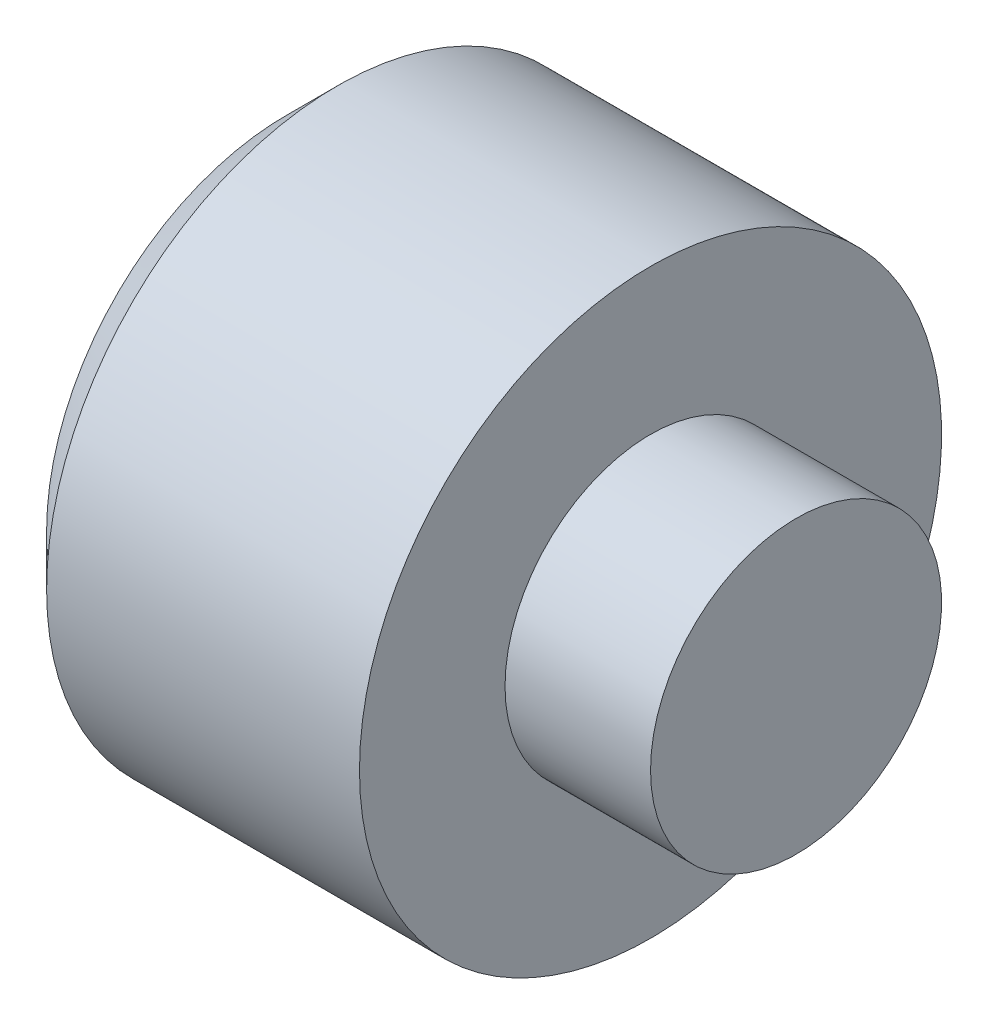
ISO-10303-21;
HEADER;
FILE_DESCRIPTION(('STEP AP214'),'2;1');
FILE_NAME('part.step','',(''),(''),'','','');
FILE_SCHEMA(('AUTOMOTIVE_DESIGN { 1 0 10303 214 1 1 1 1 }'));
ENDSEC;
DATA;
#1=APPLICATION_CONTEXT('core data for automotive mechanical design processes');
#2=APPLICATION_PROTOCOL_DEFINITION('international standard','automotive_design',2000,#1);
#3=PRODUCT_CONTEXT('',#1,'mechanical');
#4=PRODUCT('Part','Part','',(#3));
#5=PRODUCT_RELATED_PRODUCT_CATEGORY('part','',(#4));
#6=PRODUCT_DEFINITION_FORMATION('','',#4);
#7=PRODUCT_DEFINITION_CONTEXT('part definition',#1,'design');
#8=PRODUCT_DEFINITION('design','',#6,#7);
#9=PRODUCT_DEFINITION_SHAPE('','',#8);
#10=(LENGTH_UNIT() NAMED_UNIT(*) SI_UNIT(.MILLI.,.METRE.));
#11=(NAMED_UNIT(*) PLANE_ANGLE_UNIT() SI_UNIT($,.RADIAN.));
#12=(NAMED_UNIT(*) SI_UNIT($,.STERADIAN.) SOLID_ANGLE_UNIT());
#13=UNCERTAINTY_MEASURE_WITH_UNIT(LENGTH_MEASURE(1.E-05),#10,'distance_accuracy_value','');
#14=(GEOMETRIC_REPRESENTATION_CONTEXT(3) GLOBAL_UNCERTAINTY_ASSIGNED_CONTEXT((#13)) GLOBAL_UNIT_ASSIGNED_CONTEXT((#10,
#11,#12)) REPRESENTATION_CONTEXT('',''));
#15=CARTESIAN_POINT('',(0.,0.,0.));
#16=DIRECTION('',(0.,0.,1.));
#17=DIRECTION('',(1.,0.,0.));
#18=AXIS2_PLACEMENT_3D('',#15,#16,#17);
#19=CARTESIAN_POINT('',(0.,0.,0.));
#20=DIRECTION('',(-1.,0.,0.));
#21=DIRECTION('',(0.,0.,1.));
#22=AXIS2_PLACEMENT_3D('',#19,#20,#21);
#23=PLANE('',#22);
#24=CARTESIAN_POINT('',(0.,0.,0.));
#25=DIRECTION('',(-1.,0.,0.));
#26=DIRECTION('',(0.,0.,1.));
#27=AXIS2_PLACEMENT_3D('',#24,#25,#26);
#28=CIRCLE('',#27,3.29999999999999);
#29=CARTESIAN_POINT('',(0.,0.,3.29999999999999));
#30=VERTEX_POINT('',#29);
#31=EDGE_CURVE('E35',#30,#30,#28,.T.);
#32=ORIENTED_EDGE('',*,*,#31,.T.);
#33=EDGE_LOOP('',(#32));
#34=FACE_BOUND('',#33,.T.);
#35=ADVANCED_FACE('F29',(#34),#23,.T.);
#36=CARTESIAN_POINT('',(-2.,0.,0.));
#37=DIRECTION('',(-1.,0.,0.));
#38=DIRECTION('',(0.,0.,1.));
#39=AXIS2_PLACEMENT_3D('',#36,#37,#38);
#40=CYLINDRICAL_SURFACE('',#39,4.);
#41=CARTESIAN_POINT('',(0.700000000000005,0.,0.));
#42=DIRECTION('',(-1.,0.,0.));
#43=DIRECTION('',(0.,0.,1.));
#44=AXIS2_PLACEMENT_3D('',#41,#42,#43);
#45=CIRCLE('',#44,4.);
#46=CARTESIAN_POINT('',(0.700000000000005,0.,4.));
#47=VERTEX_POINT('',#46);
#48=EDGE_CURVE('E10',#47,#47,#45,.F.);
#49=ORIENTED_EDGE('',*,*,#48,.T.);
#50=EDGE_LOOP('',(#49));
#51=FACE_BOUND('',#50,.T.);
#52=CARTESIAN_POINT('',(5.,0.,0.));
#53=DIRECTION('',(-1.,0.,0.));
#54=DIRECTION('',(0.,0.,1.));
#55=AXIS2_PLACEMENT_3D('',#52,#53,#54);
#56=CIRCLE('',#55,4.);
#57=CARTESIAN_POINT('',(5.,0.,4.));
#58=VERTEX_POINT('',#57);
#59=EDGE_CURVE('E39',#58,#58,#56,.T.);
#60=ORIENTED_EDGE('',*,*,#59,.T.);
#61=EDGE_LOOP('',(#60));
#62=FACE_BOUND('',#61,.T.);
#63=ADVANCED_FACE('F68',(#51,#62),#40,.T.);
#64=CARTESIAN_POINT('',(5.,4.,0.));
#65=DIRECTION('',(1.,0.,0.));
#66=DIRECTION('',(0.,0.,-1.));
#67=AXIS2_PLACEMENT_3D('',#64,#65,#66);
#68=PLANE('',#67);
#69=CARTESIAN_POINT('',(5.,0.,0.));
#70=DIRECTION('',(-1.,0.,0.));
#71=DIRECTION('',(0.,0.,1.));
#72=AXIS2_PLACEMENT_3D('',#69,#70,#71);
#73=CIRCLE('',#72,2.);
#74=CARTESIAN_POINT('',(5.,0.,2.));
#75=VERTEX_POINT('',#74);
#76=EDGE_CURVE('E43',#75,#75,#73,.T.);
#77=ORIENTED_EDGE('',*,*,#76,.T.);
#78=EDGE_LOOP('',(#77));
#79=FACE_BOUND('',#78,.T.);
#80=ORIENTED_EDGE('',*,*,#59,.F.);
#81=EDGE_LOOP('',(#80));
#82=FACE_BOUND('',#81,.T.);
#83=ADVANCED_FACE('F65',(#79,#82),#68,.T.);
#84=CARTESIAN_POINT('',(-2.,0.,0.));
#85=DIRECTION('',(-1.,0.,0.));
#86=DIRECTION('',(0.,0.,1.));
#87=AXIS2_PLACEMENT_3D('',#84,#85,#86);
#88=CYLINDRICAL_SURFACE('',#87,2.);
#89=CARTESIAN_POINT('',(7.,0.,0.));
#90=DIRECTION('',(-1.,0.,0.));
#91=DIRECTION('',(0.,0.,1.));
#92=AXIS2_PLACEMENT_3D('',#89,#90,#91);
#93=CIRCLE('',#92,2.);
#94=CARTESIAN_POINT('',(7.,0.,2.));
#95=VERTEX_POINT('',#94);
#96=EDGE_CURVE('E48',#95,#95,#93,.T.);
#97=ORIENTED_EDGE('',*,*,#96,.T.);
#98=EDGE_LOOP('',(#97));
#99=FACE_BOUND('',#98,.T.);
#100=ORIENTED_EDGE('',*,*,#76,.F.);
#101=EDGE_LOOP('',(#100));
#102=FACE_BOUND('',#101,.T.);
#103=ADVANCED_FACE('F52',(#99,#102),#88,.T.);
#104=CARTESIAN_POINT('',(7.,2.,0.));
#105=DIRECTION('',(1.,0.,0.));
#106=DIRECTION('',(0.,0.,-1.));
#107=AXIS2_PLACEMENT_3D('',#104,#105,#106);
#108=PLANE('',#107);
#109=ORIENTED_EDGE('',*,*,#96,.F.);
#110=EDGE_LOOP('',(#109));
#111=FACE_BOUND('',#110,.T.);
#112=ADVANCED_FACE('F55',(#111),#108,.T.);
#113=CARTESIAN_POINT('',(0.,0.,0.));
#114=DIRECTION('',(1.,0.,0.));
#115=DIRECTION('',(0.,0.,-1.));
#116=AXIS2_PLACEMENT_3D('',#113,#114,#115);
#117=CONICAL_SURFACE('',#116,3.29999999999999,0.785398163397454);
#118=ORIENTED_EDGE('',*,*,#48,.F.);
#119=EDGE_LOOP('',(#118));
#120=FACE_BOUND('',#119,.T.);
#121=ORIENTED_EDGE('',*,*,#31,.F.);
#122=EDGE_LOOP('',(#121));
#123=FACE_BOUND('',#122,.T.);
#124=ADVANCED_FACE('F57',(#120,#123),#117,.T.);
#125=CLOSED_SHELL('',(#35,#63,#83,#103,#112,#124));
#126=MANIFOLD_SOLID_BREP('B2',#125);
#127=ADVANCED_BREP_SHAPE_REPRESENTATION('',(#18,#126),#14);
#128=SHAPE_DEFINITION_REPRESENTATION(#9,#127);
ENDSEC;
END-ISO-10303-21;
